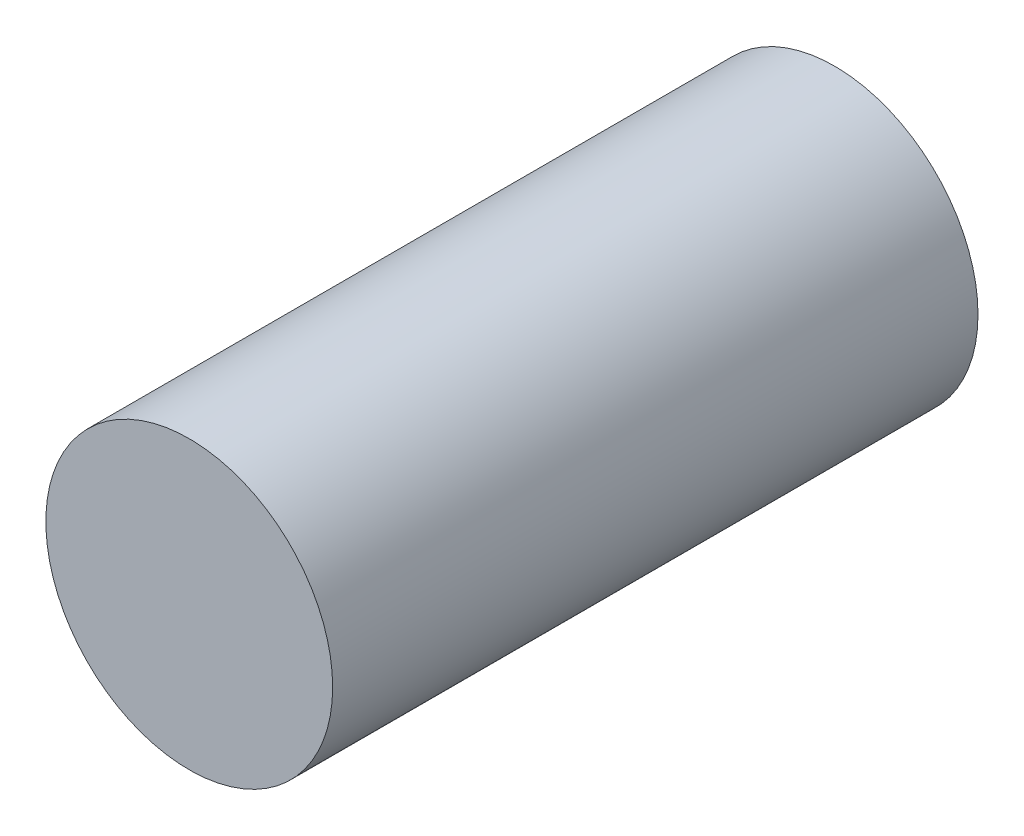
ISO-10303-21;
HEADER;
FILE_DESCRIPTION(('STEP AP214'),'2;1');
FILE_NAME('part.step','',(''),(''),'','','');
FILE_SCHEMA(('AUTOMOTIVE_DESIGN { 1 0 10303 214 1 1 1 1 }'));
ENDSEC;
DATA;
#1=APPLICATION_CONTEXT('core data for automotive mechanical design processes');
#2=APPLICATION_PROTOCOL_DEFINITION('international standard','automotive_design',2000,#1);
#3=PRODUCT_CONTEXT('',#1,'mechanical');
#4=PRODUCT('Part','Part','',(#3));
#5=PRODUCT_RELATED_PRODUCT_CATEGORY('part','',(#4));
#6=PRODUCT_DEFINITION_FORMATION('','',#4);
#7=PRODUCT_DEFINITION_CONTEXT('part definition',#1,'design');
#8=PRODUCT_DEFINITION('design','',#6,#7);
#9=PRODUCT_DEFINITION_SHAPE('','',#8);
#10=(LENGTH_UNIT() NAMED_UNIT(*) SI_UNIT(.MILLI.,.METRE.));
#11=(NAMED_UNIT(*) PLANE_ANGLE_UNIT() SI_UNIT($,.RADIAN.));
#12=(NAMED_UNIT(*) SI_UNIT($,.STERADIAN.) SOLID_ANGLE_UNIT());
#13=UNCERTAINTY_MEASURE_WITH_UNIT(LENGTH_MEASURE(1.E-05),#10,'distance_accuracy_value','');
#14=(GEOMETRIC_REPRESENTATION_CONTEXT(3) GLOBAL_UNCERTAINTY_ASSIGNED_CONTEXT((#13)) GLOBAL_UNIT_ASSIGNED_CONTEXT((#10,
#11,#12)) REPRESENTATION_CONTEXT('',''));
#15=CARTESIAN_POINT('',(0.,0.,0.));
#16=DIRECTION('',(0.,0.,1.));
#17=DIRECTION('',(1.,0.,0.));
#18=AXIS2_PLACEMENT_3D('',#15,#16,#17);
#19=CARTESIAN_POINT('',(0.,0.,135.));
#20=DIRECTION('',(0.,0.,-1.));
#21=DIRECTION('',(-1.,0.,0.));
#22=AXIS2_PLACEMENT_3D('',#19,#20,#21);
#23=CYLINDRICAL_SURFACE('',#22,30.);
#24=CARTESIAN_POINT('',(0.,0.,135.));
#25=DIRECTION('',(0.,0.,1.));
#26=DIRECTION('',(1.,0.,0.));
#27=AXIS2_PLACEMENT_3D('',#24,#25,#26);
#28=CIRCLE('',#27,30.);
#29=CARTESIAN_POINT('',(30.,0.,135.));
#30=VERTEX_POINT('',#29);
#31=EDGE_CURVE('E10',#30,#30,#28,.T.);
#32=ORIENTED_EDGE('',*,*,#31,.F.);
#33=EDGE_LOOP('',(#32));
#34=FACE_BOUND('',#33,.T.);
#35=CARTESIAN_POINT('',(0.,0.,0.));
#36=DIRECTION('',(0.,0.,1.));
#37=DIRECTION('',(1.,0.,0.));
#38=AXIS2_PLACEMENT_3D('',#35,#36,#37);
#39=CIRCLE('',#38,30.);
#40=CARTESIAN_POINT('',(30.,0.,0.));
#41=VERTEX_POINT('',#40);
#42=EDGE_CURVE('E40',#41,#41,#39,.T.);
#43=ORIENTED_EDGE('',*,*,#42,.T.);
#44=EDGE_LOOP('',(#43));
#45=FACE_BOUND('',#44,.T.);
#46=ADVANCED_FACE('F37',(#34,#45),#23,.T.);
#47=CARTESIAN_POINT('',(0.,0.,135.));
#48=DIRECTION('',(0.,0.,1.));
#49=DIRECTION('',(1.,0.,0.));
#50=AXIS2_PLACEMENT_3D('',#47,#48,#49);
#51=PLANE('',#50);
#52=ORIENTED_EDGE('',*,*,#31,.T.);
#53=EDGE_LOOP('',(#52));
#54=FACE_BOUND('',#53,.T.);
#55=ADVANCED_FACE('F54',(#54),#51,.T.);
#56=CARTESIAN_POINT('',(0.,0.,0.));
#57=DIRECTION('',(0.,0.,1.));
#58=DIRECTION('',(1.,0.,0.));
#59=AXIS2_PLACEMENT_3D('',#56,#57,#58);
#60=PLANE('',#59);
#61=ORIENTED_EDGE('',*,*,#42,.F.);
#62=EDGE_LOOP('',(#61));
#63=FACE_BOUND('',#62,.T.);
#64=ADVANCED_FACE('F52',(#63),#60,.F.);
#65=CLOSED_SHELL('',(#46,#55,#64));
#66=MANIFOLD_SOLID_BREP('B2',#65);
#67=ADVANCED_BREP_SHAPE_REPRESENTATION('',(#18,#66),#14);
#68=SHAPE_DEFINITION_REPRESENTATION(#9,#67);
ENDSEC;
END-ISO-10303-21;
